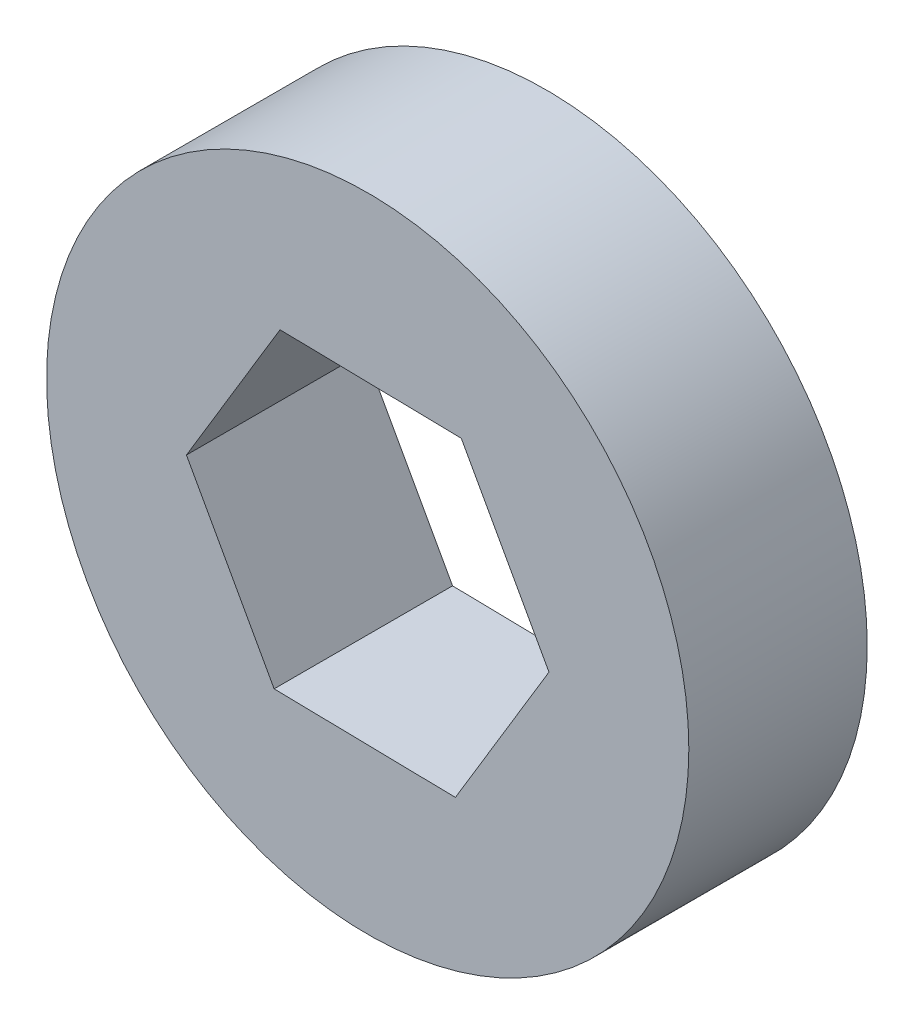
ISO-10303-21;
HEADER;
FILE_DESCRIPTION(('STEP AP214'),'2;1');
FILE_NAME('part.step','',(''),(''),'','','');
FILE_SCHEMA(('AUTOMOTIVE_DESIGN { 1 0 10303 214 1 1 1 1 }'));
ENDSEC;
DATA;
#1=APPLICATION_CONTEXT('core data for automotive mechanical design processes');
#2=APPLICATION_PROTOCOL_DEFINITION('international standard','automotive_design',2000,#1);
#3=PRODUCT_CONTEXT('',#1,'mechanical');
#4=PRODUCT('Part','Part','',(#3));
#5=PRODUCT_RELATED_PRODUCT_CATEGORY('part','',(#4));
#6=PRODUCT_DEFINITION_FORMATION('','',#4);
#7=PRODUCT_DEFINITION_CONTEXT('part definition',#1,'design');
#8=PRODUCT_DEFINITION('design','',#6,#7);
#9=PRODUCT_DEFINITION_SHAPE('','',#8);
#10=(LENGTH_UNIT() NAMED_UNIT(*) SI_UNIT(.MILLI.,.METRE.));
#11=(NAMED_UNIT(*) PLANE_ANGLE_UNIT() SI_UNIT($,.RADIAN.));
#12=(NAMED_UNIT(*) SI_UNIT($,.STERADIAN.) SOLID_ANGLE_UNIT());
#13=UNCERTAINTY_MEASURE_WITH_UNIT(LENGTH_MEASURE(1.E-05),#10,'distance_accuracy_value','');
#14=(GEOMETRIC_REPRESENTATION_CONTEXT(3) GLOBAL_UNCERTAINTY_ASSIGNED_CONTEXT((#13)) GLOBAL_UNIT_ASSIGNED_CONTEXT((#10,
#11,#12)) REPRESENTATION_CONTEXT('',''));
#15=CARTESIAN_POINT('',(0.,0.,0.));
#16=DIRECTION('',(0.,0.,1.));
#17=DIRECTION('',(1.,0.,0.));
#18=AXIS2_PLACEMENT_3D('',#15,#16,#17);
#19=CARTESIAN_POINT('',(0.,0.,6.35));
#20=DIRECTION('',(0.,0.,1.));
#21=DIRECTION('',(1.,0.,0.));
#22=AXIS2_PLACEMENT_3D('',#19,#20,#21);
#23=PLANE('',#22);
#24=CARTESIAN_POINT('',(0.,0.,6.35));
#25=DIRECTION('',(0.,0.,1.));
#26=DIRECTION('',(1.,0.,0.));
#27=AXIS2_PLACEMENT_3D('',#24,#25,#26);
#28=CIRCLE('',#27,11.43);
#29=CARTESIAN_POINT('',(11.43,0.,6.35));
#30=VERTEX_POINT('',#29);
#31=EDGE_CURVE('E11',#30,#30,#28,.T.);
#32=ORIENTED_EDGE('',*,*,#31,.T.);
#33=EDGE_LOOP('',(#32));
#34=FACE_BOUND('',#33,.T.);
#35=DIRECTION('',(0.999825086009298,-0.0187028710763924,0.));
#36=VECTOR('',#35,1.);
#37=CARTESIAN_POINT('',(-3.33018063446433,-5.52668275506855,6.35));
#38=LINE('',#37,#36);
#39=CARTESIAN_POINT('',(-3.33018063446433,-5.52668275506855,6.35));
#40=VERTEX_POINT('',#39);
#41=CARTESIAN_POINT('',(3.12115734731457,-5.64736240617137,6.35));
#42=VERTEX_POINT('',#41);
#43=EDGE_CURVE('E99',#40,#42,#38,.T.);
#44=ORIENTED_EDGE('',*,*,#43,.F.);
#45=DIRECTION('',(0.483715381528788,-0.875225359363209,0.));
#46=VECTOR('',#45,1.);
#47=CARTESIAN_POINT('',(-6.4513379817789,0.120679651102814,6.35));
#48=LINE('',#47,#46);
#49=CARTESIAN_POINT('',(-6.4513379817789,0.120679651102814,6.35));
#50=VERTEX_POINT('',#49);
#51=EDGE_CURVE('E95',#50,#40,#48,.T.);
#52=ORIENTED_EDGE('',*,*,#51,.F.);
#53=DIRECTION('',(-0.51610970448051,-0.856522488286817,0.));
#54=VECTOR('',#53,1.);
#55=CARTESIAN_POINT('',(-3.12115734731457,5.64736240617136,6.35));
#56=LINE('',#55,#54);
#57=CARTESIAN_POINT('',(-3.12115734731457,5.64736240617136,6.35));
#58=VERTEX_POINT('',#57);
#59=EDGE_CURVE('E118',#58,#50,#56,.T.);
#60=ORIENTED_EDGE('',*,*,#59,.F.);
#61=DIRECTION('',(-0.999825086009298,0.0187028710763921,0.));
#62=VECTOR('',#61,1.);
#63=CARTESIAN_POINT('',(3.33018063446433,5.52668275506855,6.35));
#64=LINE('',#63,#62);
#65=CARTESIAN_POINT('',(3.33018063446433,5.52668275506855,6.35));
#66=VERTEX_POINT('',#65);
#67=EDGE_CURVE('E119',#66,#58,#64,.T.);
#68=ORIENTED_EDGE('',*,*,#67,.F.);
#69=DIRECTION('',(-0.483715381528788,0.875225359363209,0.));
#70=VECTOR('',#69,1.);
#71=CARTESIAN_POINT('',(6.4513379817789,-0.120679651102812,6.35));
#72=LINE('',#71,#70);
#73=CARTESIAN_POINT('',(6.4513379817789,-0.120679651102812,6.35));
#74=VERTEX_POINT('',#73);
#75=EDGE_CURVE('E111',#74,#66,#72,.T.);
#76=ORIENTED_EDGE('',*,*,#75,.F.);
#77=DIRECTION('',(0.51610970448051,0.856522488286817,0.));
#78=VECTOR('',#77,1.);
#79=CARTESIAN_POINT('',(3.12115734731457,-5.64736240617137,6.35));
#80=LINE('',#79,#78);
#81=EDGE_CURVE('E115',#42,#74,#80,.T.);
#82=ORIENTED_EDGE('',*,*,#81,.F.);
#83=EDGE_LOOP('',(#44,#52,#60,#68,#76,#82));
#84=FACE_BOUND('',#83,.T.);
#85=ADVANCED_FACE('F39',(#34,#84),#23,.T.);
#86=CARTESIAN_POINT('',(0.,0.,0.));
#87=DIRECTION('',(0.,0.,1.));
#88=DIRECTION('',(1.,0.,0.));
#89=AXIS2_PLACEMENT_3D('',#86,#87,#88);
#90=PLANE('',#89);
#91=CARTESIAN_POINT('',(0.,0.,0.));
#92=DIRECTION('',(0.,0.,1.));
#93=DIRECTION('',(1.,0.,0.));
#94=AXIS2_PLACEMENT_3D('',#91,#92,#93);
#95=CIRCLE('',#94,11.43);
#96=CARTESIAN_POINT('',(11.43,0.,0.));
#97=VERTEX_POINT('',#96);
#98=EDGE_CURVE('E43',#97,#97,#95,.T.);
#99=ORIENTED_EDGE('',*,*,#98,.F.);
#100=EDGE_LOOP('',(#99));
#101=FACE_BOUND('',#100,.T.);
#102=DIRECTION('',(0.483715381528788,-0.875225359363209,0.));
#103=VECTOR('',#102,1.);
#104=CARTESIAN_POINT('',(-6.4513379817789,0.120679651102814,0.));
#105=LINE('',#104,#103);
#106=CARTESIAN_POINT('',(-6.4513379817789,0.120679651102814,0.));
#107=VERTEX_POINT('',#106);
#108=CARTESIAN_POINT('',(-3.33018063446433,-5.52668275506855,0.));
#109=VERTEX_POINT('',#108);
#110=EDGE_CURVE('E65',#107,#109,#105,.T.);
#111=ORIENTED_EDGE('',*,*,#110,.T.);
#112=DIRECTION('',(0.999825086009298,-0.0187028710763924,0.));
#113=VECTOR('',#112,1.);
#114=CARTESIAN_POINT('',(-3.33018063446433,-5.52668275506855,0.));
#115=LINE('',#114,#113);
#116=CARTESIAN_POINT('',(3.12115734731457,-5.64736240617137,0.));
#117=VERTEX_POINT('',#116);
#118=EDGE_CURVE('E110',#109,#117,#115,.T.);
#119=ORIENTED_EDGE('',*,*,#118,.T.);
#120=DIRECTION('',(0.51610970448051,0.856522488286817,0.));
#121=VECTOR('',#120,1.);
#122=CARTESIAN_POINT('',(3.12115734731457,-5.64736240617137,0.));
#123=LINE('',#122,#121);
#124=CARTESIAN_POINT('',(6.4513379817789,-0.120679651102812,0.));
#125=VERTEX_POINT('',#124);
#126=EDGE_CURVE('E125',#117,#125,#123,.T.);
#127=ORIENTED_EDGE('',*,*,#126,.T.);
#128=DIRECTION('',(-0.483715381528788,0.875225359363209,0.));
#129=VECTOR('',#128,1.);
#130=CARTESIAN_POINT('',(6.4513379817789,-0.120679651102812,0.));
#131=LINE('',#130,#129);
#132=CARTESIAN_POINT('',(3.33018063446433,5.52668275506855,0.));
#133=VERTEX_POINT('',#132);
#134=EDGE_CURVE('E130',#125,#133,#131,.T.);
#135=ORIENTED_EDGE('',*,*,#134,.T.);
#136=DIRECTION('',(-0.999825086009298,0.0187028710763921,0.));
#137=VECTOR('',#136,1.);
#138=CARTESIAN_POINT('',(3.33018063446433,5.52668275506855,0.));
#139=LINE('',#138,#137);
#140=CARTESIAN_POINT('',(-3.12115734731457,5.64736240617136,0.));
#141=VERTEX_POINT('',#140);
#142=EDGE_CURVE('E128',#133,#141,#139,.T.);
#143=ORIENTED_EDGE('',*,*,#142,.T.);
#144=DIRECTION('',(-0.51610970448051,-0.856522488286817,0.));
#145=VECTOR('',#144,1.);
#146=CARTESIAN_POINT('',(-3.12115734731457,5.64736240617136,0.));
#147=LINE('',#146,#145);
#148=EDGE_CURVE('E101',#141,#107,#147,.T.);
#149=ORIENTED_EDGE('',*,*,#148,.T.);
#150=EDGE_LOOP('',(#111,#119,#127,#135,#143,#149));
#151=FACE_BOUND('',#150,.T.);
#152=ADVANCED_FACE('F150',(#101,#151),#90,.F.);
#153=CARTESIAN_POINT('',(0.,0.,6.35));
#154=DIRECTION('',(0.,0.,-1.));
#155=DIRECTION('',(-1.,0.,0.));
#156=AXIS2_PLACEMENT_3D('',#153,#154,#155);
#157=CYLINDRICAL_SURFACE('',#156,11.43);
#158=ORIENTED_EDGE('',*,*,#31,.F.);
#159=EDGE_LOOP('',(#158));
#160=FACE_BOUND('',#159,.T.);
#161=ORIENTED_EDGE('',*,*,#98,.T.);
#162=EDGE_LOOP('',(#161));
#163=FACE_BOUND('',#162,.T.);
#164=ADVANCED_FACE('F41',(#160,#163),#157,.T.);
#165=CARTESIAN_POINT('',(-6.4513379817789,0.120679651102814,6.35));
#166=DIRECTION('',(0.875225359363209,0.483715381528788,0.));
#167=DIRECTION('',(-0.483715381528788,0.875225359363209,0.));
#168=AXIS2_PLACEMENT_3D('',#165,#166,#167);
#169=PLANE('',#168);
#170=ORIENTED_EDGE('',*,*,#110,.F.);
#171=DIRECTION('',(0.,0.,-1.));
#172=VECTOR('',#171,1.);
#173=CARTESIAN_POINT('',(-6.4513379817789,0.120679651102814,6.35));
#174=LINE('',#173,#172);
#175=EDGE_CURVE('E96',#50,#107,#174,.T.);
#176=ORIENTED_EDGE('',*,*,#175,.F.);
#177=ORIENTED_EDGE('',*,*,#51,.T.);
#178=DIRECTION('',(0.,0.,-1.));
#179=VECTOR('',#178,1.);
#180=CARTESIAN_POINT('',(-3.33018063446433,-5.52668275506855,6.35));
#181=LINE('',#180,#179);
#182=EDGE_CURVE('E92',#40,#109,#181,.T.);
#183=ORIENTED_EDGE('',*,*,#182,.T.);
#184=EDGE_LOOP('',(#170,#176,#177,#183));
#185=FACE_BOUND('',#184,.T.);
#186=ADVANCED_FACE('F94',(#185),#169,.T.);
#187=CARTESIAN_POINT('',(-3.33018063446433,-5.52668275506855,6.35));
#188=DIRECTION('',(0.0187028710763924,0.999825086009298,0.));
#189=DIRECTION('',(-0.999825086009298,0.0187028710763924,0.));
#190=AXIS2_PLACEMENT_3D('',#187,#188,#189);
#191=PLANE('',#190);
#192=ORIENTED_EDGE('',*,*,#118,.F.);
#193=ORIENTED_EDGE('',*,*,#182,.F.);
#194=ORIENTED_EDGE('',*,*,#43,.T.);
#195=DIRECTION('',(0.,0.,-1.));
#196=VECTOR('',#195,1.);
#197=CARTESIAN_POINT('',(3.12115734731457,-5.64736240617137,6.35));
#198=LINE('',#197,#196);
#199=EDGE_CURVE('E107',#42,#117,#198,.T.);
#200=ORIENTED_EDGE('',*,*,#199,.T.);
#201=EDGE_LOOP('',(#192,#193,#194,#200));
#202=FACE_BOUND('',#201,.T.);
#203=ADVANCED_FACE('F102',(#202),#191,.T.);
#204=CARTESIAN_POINT('',(3.12115734731457,-5.64736240617137,6.35));
#205=DIRECTION('',(-0.856522488286817,0.51610970448051,0.));
#206=DIRECTION('',(-0.51610970448051,-0.856522488286817,0.));
#207=AXIS2_PLACEMENT_3D('',#204,#205,#206);
#208=PLANE('',#207);
#209=ORIENTED_EDGE('',*,*,#126,.F.);
#210=ORIENTED_EDGE('',*,*,#199,.F.);
#211=ORIENTED_EDGE('',*,*,#81,.T.);
#212=DIRECTION('',(0.,0.,-1.));
#213=VECTOR('',#212,1.);
#214=CARTESIAN_POINT('',(6.4513379817789,-0.120679651102812,6.35));
#215=LINE('',#214,#213);
#216=EDGE_CURVE('E140',#74,#125,#215,.T.);
#217=ORIENTED_EDGE('',*,*,#216,.T.);
#218=EDGE_LOOP('',(#209,#210,#211,#217));
#219=FACE_BOUND('',#218,.T.);
#220=ADVANCED_FACE('F141',(#219),#208,.T.);
#221=CARTESIAN_POINT('',(6.4513379817789,-0.120679651102812,6.35));
#222=DIRECTION('',(-0.875225359363209,-0.483715381528788,0.));
#223=DIRECTION('',(0.483715381528788,-0.875225359363209,0.));
#224=AXIS2_PLACEMENT_3D('',#221,#222,#223);
#225=PLANE('',#224);
#226=ORIENTED_EDGE('',*,*,#134,.F.);
#227=ORIENTED_EDGE('',*,*,#216,.F.);
#228=ORIENTED_EDGE('',*,*,#75,.T.);
#229=DIRECTION('',(0.,0.,-1.));
#230=VECTOR('',#229,1.);
#231=CARTESIAN_POINT('',(3.33018063446433,5.52668275506855,6.35));
#232=LINE('',#231,#230);
#233=EDGE_CURVE('E139',#66,#133,#232,.T.);
#234=ORIENTED_EDGE('',*,*,#233,.T.);
#235=EDGE_LOOP('',(#226,#227,#228,#234));
#236=FACE_BOUND('',#235,.T.);
#237=ADVANCED_FACE('F154',(#236),#225,.T.);
#238=CARTESIAN_POINT('',(3.33018063446433,5.52668275506855,6.35));
#239=DIRECTION('',(-0.0187028710763921,-0.999825086009298,0.));
#240=DIRECTION('',(0.999825086009298,-0.0187028710763921,0.));
#241=AXIS2_PLACEMENT_3D('',#238,#239,#240);
#242=PLANE('',#241);
#243=ORIENTED_EDGE('',*,*,#142,.F.);
#244=ORIENTED_EDGE('',*,*,#233,.F.);
#245=ORIENTED_EDGE('',*,*,#67,.T.);
#246=DIRECTION('',(0.,0.,-1.));
#247=VECTOR('',#246,1.);
#248=CARTESIAN_POINT('',(-3.12115734731457,5.64736240617136,6.35));
#249=LINE('',#248,#247);
#250=EDGE_CURVE('E53',#58,#141,#249,.T.);
#251=ORIENTED_EDGE('',*,*,#250,.T.);
#252=EDGE_LOOP('',(#243,#244,#245,#251));
#253=FACE_BOUND('',#252,.T.);
#254=ADVANCED_FACE('F153',(#253),#242,.T.);
#255=CARTESIAN_POINT('',(-3.12115734731457,5.64736240617136,6.35));
#256=DIRECTION('',(0.856522488286817,-0.51610970448051,0.));
#257=DIRECTION('',(0.51610970448051,0.856522488286817,0.));
#258=AXIS2_PLACEMENT_3D('',#255,#256,#257);
#259=PLANE('',#258);
#260=ORIENTED_EDGE('',*,*,#148,.F.);
#261=ORIENTED_EDGE('',*,*,#250,.F.);
#262=ORIENTED_EDGE('',*,*,#59,.T.);
#263=ORIENTED_EDGE('',*,*,#175,.T.);
#264=EDGE_LOOP('',(#260,#261,#262,#263));
#265=FACE_BOUND('',#264,.T.);
#266=ADVANCED_FACE('F149',(#265),#259,.T.);
#267=CLOSED_SHELL('',(#85,#152,#164,#186,#203,#220,#237,#254,#266));
#268=MANIFOLD_SOLID_BREP('B2',#267);
#269=ADVANCED_BREP_SHAPE_REPRESENTATION('',(#18,#268),#14);
#270=SHAPE_DEFINITION_REPRESENTATION(#9,#269);
ENDSEC;
END-ISO-10303-21;
